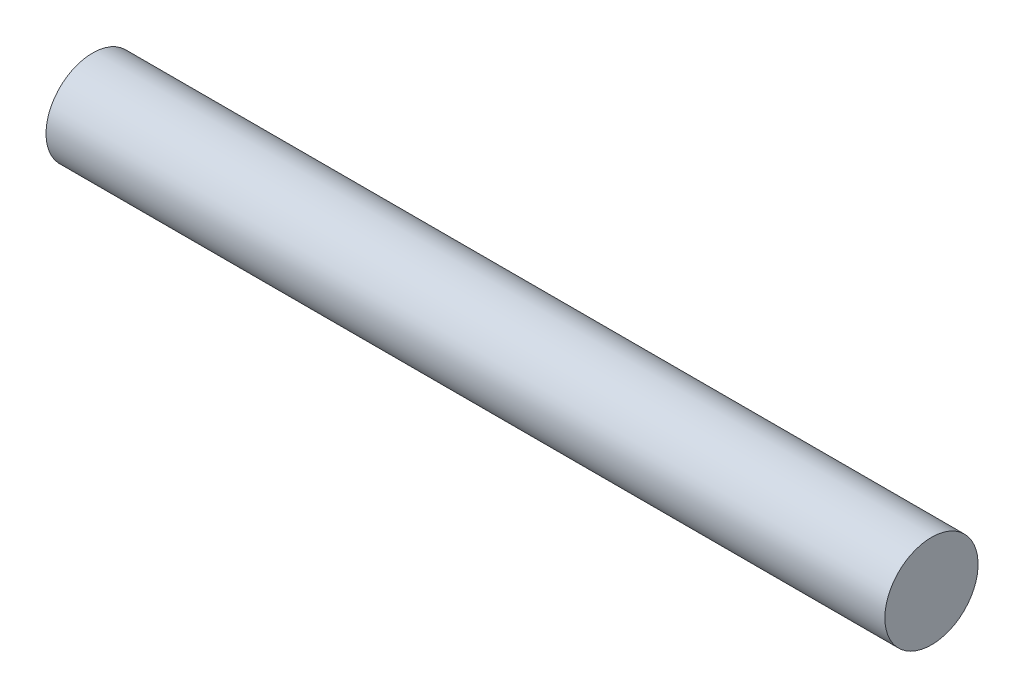
ISO-10303-21;
HEADER;
FILE_DESCRIPTION(('STEP AP214'),'2;1');
FILE_NAME('part.step','',(''),(''),'','','');
FILE_SCHEMA(('AUTOMOTIVE_DESIGN { 1 0 10303 214 1 1 1 1 }'));
ENDSEC;
DATA;
#1=APPLICATION_CONTEXT('core data for automotive mechanical design processes');
#2=APPLICATION_PROTOCOL_DEFINITION('international standard','automotive_design',2000,#1);
#3=PRODUCT_CONTEXT('',#1,'mechanical');
#4=PRODUCT('Part','Part','',(#3));
#5=PRODUCT_RELATED_PRODUCT_CATEGORY('part','',(#4));
#6=PRODUCT_DEFINITION_FORMATION('','',#4);
#7=PRODUCT_DEFINITION_CONTEXT('part definition',#1,'design');
#8=PRODUCT_DEFINITION('design','',#6,#7);
#9=PRODUCT_DEFINITION_SHAPE('','',#8);
#10=(LENGTH_UNIT() NAMED_UNIT(*) SI_UNIT(.MILLI.,.METRE.));
#11=(NAMED_UNIT(*) PLANE_ANGLE_UNIT() SI_UNIT($,.RADIAN.));
#12=(NAMED_UNIT(*) SI_UNIT($,.STERADIAN.) SOLID_ANGLE_UNIT());
#13=UNCERTAINTY_MEASURE_WITH_UNIT(LENGTH_MEASURE(1.E-05),#10,'distance_accuracy_value','');
#14=(GEOMETRIC_REPRESENTATION_CONTEXT(3) GLOBAL_UNCERTAINTY_ASSIGNED_CONTEXT((#13)) GLOBAL_UNIT_ASSIGNED_CONTEXT((#10,
#11,#12)) REPRESENTATION_CONTEXT('',''));
#15=CARTESIAN_POINT('',(0.,0.,0.));
#16=DIRECTION('',(0.,0.,1.));
#17=DIRECTION('',(1.,0.,0.));
#18=AXIS2_PLACEMENT_3D('',#15,#16,#17);
#19=CARTESIAN_POINT('',(22.5,0.,0.));
#20=DIRECTION('',(-1.,0.,0.));
#21=DIRECTION('',(0.,0.,1.));
#22=AXIS2_PLACEMENT_3D('',#19,#20,#21);
#23=CYLINDRICAL_SURFACE('',#22,2.5);
#24=CARTESIAN_POINT('',(22.5,0.,0.));
#25=DIRECTION('',(1.,0.,0.));
#26=DIRECTION('',(0.,0.,-1.));
#27=AXIS2_PLACEMENT_3D('',#24,#25,#26);
#28=CIRCLE('',#27,2.5);
#29=CARTESIAN_POINT('',(22.5,0.,2.5));
#30=VERTEX_POINT('',#29);
#31=EDGE_CURVE('E12',#30,#30,#28,.T.);
#32=CARTESIAN_POINT('',(-22.5,0.,0.));
#33=DIRECTION('',(1.,0.,0.));
#34=DIRECTION('',(0.,0.,-1.));
#35=AXIS2_PLACEMENT_3D('',#32,#33,#34);
#36=CIRCLE('',#35,2.5);
#37=CARTESIAN_POINT('',(-22.5,0.,2.5));
#38=VERTEX_POINT('',#37);
#39=EDGE_CURVE('E47',#38,#38,#36,.T.);
#40=CARTESIAN_POINT('',(22.5,0.,2.5));
#41=CARTESIAN_POINT('',(22.03125,0.,2.5));
#42=CARTESIAN_POINT('',(21.5625,0.,2.5));
#43=CARTESIAN_POINT('',(20.625,0.,2.5));
#44=CARTESIAN_POINT('',(20.15625,0.,2.5));
#45=CARTESIAN_POINT('',(19.21875,0.,2.5));
#46=CARTESIAN_POINT('',(18.75,0.,2.5));
#47=CARTESIAN_POINT('',(17.8125,0.,2.5));
#48=CARTESIAN_POINT('',(17.34375,0.,2.5));
#49=CARTESIAN_POINT('',(16.40625,0.,2.5));
#50=CARTESIAN_POINT('',(15.9375,0.,2.5));
#51=CARTESIAN_POINT('',(15.,0.,2.5));
#52=CARTESIAN_POINT('',(14.53125,0.,2.5));
#53=CARTESIAN_POINT('',(13.59375,0.,2.5));
#54=CARTESIAN_POINT('',(13.125,0.,2.5));
#55=CARTESIAN_POINT('',(12.1875,0.,2.5));
#56=CARTESIAN_POINT('',(11.71875,0.,2.5));
#57=CARTESIAN_POINT('',(10.78125,0.,2.5));
#58=CARTESIAN_POINT('',(10.3125,0.,2.5));
#59=CARTESIAN_POINT('',(9.37499999999999,0.,2.5));
#60=CARTESIAN_POINT('',(8.90625,0.,2.5));
#61=CARTESIAN_POINT('',(7.96874999999999,0.,2.5));
#62=CARTESIAN_POINT('',(7.5,0.,2.5));
#63=CARTESIAN_POINT('',(6.5625,0.,2.5));
#64=CARTESIAN_POINT('',(6.09374999999999,0.,2.5));
#65=CARTESIAN_POINT('',(5.15624999999999,0.,2.5));
#66=CARTESIAN_POINT('',(4.68749999999999,0.,2.5));
#67=CARTESIAN_POINT('',(3.74999999999999,0.,2.5));
#68=CARTESIAN_POINT('',(3.28124999999999,0.,2.5));
#69=CARTESIAN_POINT('',(2.34375,0.,2.5));
#70=CARTESIAN_POINT('',(1.87499999999999,0.,2.5));
#71=CARTESIAN_POINT('',(0.937499999999994,0.,2.5));
#72=CARTESIAN_POINT('',(0.468749999999993,0.,2.5));
#73=CARTESIAN_POINT('',(-0.468750000000007,0.,2.5));
#74=CARTESIAN_POINT('',(-0.937500000000008,0.,2.5));
#75=CARTESIAN_POINT('',(-1.87500000000001,0.,2.5));
#76=CARTESIAN_POINT('',(-2.34375000000001,0.,2.5));
#77=CARTESIAN_POINT('',(-3.28125000000001,0.,2.5));
#78=CARTESIAN_POINT('',(-3.75000000000001,0.,2.5));
#79=CARTESIAN_POINT('',(-4.68750000000001,0.,2.5));
#80=CARTESIAN_POINT('',(-5.15625000000001,0.,2.5));
#81=CARTESIAN_POINT('',(-6.09375000000001,0.,2.5));
#82=CARTESIAN_POINT('',(-6.56250000000001,0.,2.5));
#83=CARTESIAN_POINT('',(-7.50000000000001,0.,2.5));
#84=CARTESIAN_POINT('',(-7.96875000000001,0.,2.5));
#85=CARTESIAN_POINT('',(-8.90625000000001,0.,2.5));
#86=CARTESIAN_POINT('',(-9.37500000000001,0.,2.5));
#87=CARTESIAN_POINT('',(-10.3125,0.,2.5));
#88=CARTESIAN_POINT('',(-10.78125,0.,2.5));
#89=CARTESIAN_POINT('',(-11.71875,0.,2.5));
#90=CARTESIAN_POINT('',(-12.1875,0.,2.5));
#91=CARTESIAN_POINT('',(-13.125,0.,2.5));
#92=CARTESIAN_POINT('',(-13.59375,0.,2.5));
#93=CARTESIAN_POINT('',(-14.53125,0.,2.5));
#94=CARTESIAN_POINT('',(-15.,0.,2.5));
#95=CARTESIAN_POINT('',(-15.9375,0.,2.5));
#96=CARTESIAN_POINT('',(-16.40625,0.,2.5));
#97=CARTESIAN_POINT('',(-17.34375,0.,2.5));
#98=CARTESIAN_POINT('',(-17.8125,0.,2.5));
#99=CARTESIAN_POINT('',(-18.75,0.,2.5));
#100=CARTESIAN_POINT('',(-19.21875,0.,2.5));
#101=CARTESIAN_POINT('',(-20.15625,0.,2.5));
#102=CARTESIAN_POINT('',(-20.625,0.,2.5));
#103=CARTESIAN_POINT('',(-21.5625,0.,2.5));
#104=CARTESIAN_POINT('',(-22.03125,0.,2.5));
#105=CARTESIAN_POINT('',(-22.5,0.,2.5));
#106=B_SPLINE_CURVE_WITH_KNOTS('',3,(#40,#41,#42,#43,#44,#45,#46,#47,#48,#49,#50,#51,#52,#53,
#54,#55,#56,#57,#58,#59,#60,#61,#62,#63,#64,#65,#66,#67,#68,#69,#70,#71,#72,#73,#74,#75,#76,#77,
#78,#79,#80,#81,#82,#83,#84,#85,#86,#87,#88,#89,#90,#91,#92,#93,#94,#95,#96,#97,#98,#99,#100,
#101,#102,#103,#104,#105),.UNSPECIFIED.,.F.,.F.,(4,2,2,2,2,2,2,2,2,2,2,2,2,2,2,2,2,2,2,2,2,2,2,
2,2,2,2,2,2,2,2,2,4),(0.,1.40625,2.8125,4.21875,5.625,7.03125,8.4375,9.84375,11.25,12.65625,
14.0625,15.46875,16.875,18.28125,19.6875,21.09375,22.5,23.90625,25.3125,26.71875,28.125,
29.53125,30.9375,32.34375,33.75,35.15625,36.5625,37.96875,39.375,40.78125,42.1875,43.59375,45.),.UNSPECIFIED.);
#107=EDGE_CURVE('BSEAM44',#30,#38,#106,.T.);
#108=ORIENTED_EDGE('',*,*,#31,.F.);
#109=ORIENTED_EDGE('',*,*,#39,.T.);
#110=ORIENTED_EDGE('',*,*,#107,.T.);
#111=ORIENTED_EDGE('',*,*,#107,.F.);
#112=EDGE_LOOP('',(#108,#110,#109,#111));
#113=FACE_BOUND('',#112,.T.);
#114=ADVANCED_FACE('F44',(#113),#23,.T.);
#115=CARTESIAN_POINT('',(22.5,0.,0.));
#116=DIRECTION('',(1.,0.,0.));
#117=DIRECTION('',(0.,0.,-1.));
#118=AXIS2_PLACEMENT_3D('',#115,#116,#117);
#119=PLANE('',#118);
#120=ORIENTED_EDGE('',*,*,#31,.T.);
#121=EDGE_LOOP('',(#120));
#122=FACE_BOUND('',#121,.T.);
#123=ADVANCED_FACE('F59',(#122),#119,.T.);
#124=CARTESIAN_POINT('',(-22.5,0.,0.));
#125=DIRECTION('',(1.,0.,0.));
#126=DIRECTION('',(0.,0.,-1.));
#127=AXIS2_PLACEMENT_3D('',#124,#125,#126);
#128=PLANE('',#127);
#129=ORIENTED_EDGE('',*,*,#39,.F.);
#130=EDGE_LOOP('',(#129));
#131=FACE_BOUND('',#130,.T.);
#132=ADVANCED_FACE('F57',(#131),#128,.F.);
#133=CLOSED_SHELL('',(#114,#123,#132));
#134=MANIFOLD_SOLID_BREP('B2',#133);
#135=ADVANCED_BREP_SHAPE_REPRESENTATION('',(#18,#134),#14);
#136=SHAPE_DEFINITION_REPRESENTATION(#9,#135);
ENDSEC;
END-ISO-10303-21;
